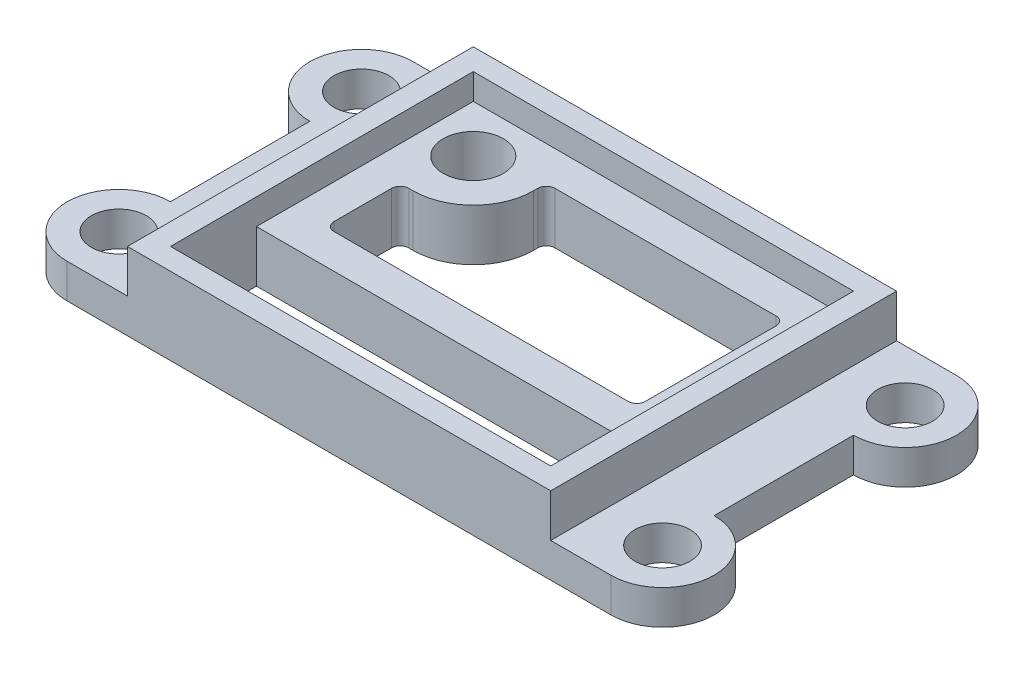
ISO-10303-21;
HEADER;
FILE_DESCRIPTION(('STEP AP214'),'2;1');
FILE_NAME('part.step','',(''),(''),'','','');
FILE_SCHEMA(('AUTOMOTIVE_DESIGN { 1 0 10303 214 1 1 1 1 }'));
ENDSEC;
DATA;
#1=APPLICATION_CONTEXT('core data for automotive mechanical design processes');
#2=APPLICATION_PROTOCOL_DEFINITION('international standard','automotive_design',2000,#1);
#3=PRODUCT_CONTEXT('',#1,'mechanical');
#4=PRODUCT('Part','Part','',(#3));
#5=PRODUCT_RELATED_PRODUCT_CATEGORY('part','',(#4));
#6=PRODUCT_DEFINITION_FORMATION('','',#4);
#7=PRODUCT_DEFINITION_CONTEXT('part definition',#1,'design');
#8=PRODUCT_DEFINITION('design','',#6,#7);
#9=PRODUCT_DEFINITION_SHAPE('','',#8);
#10=(LENGTH_UNIT() NAMED_UNIT(*) SI_UNIT(.MILLI.,.METRE.));
#11=(NAMED_UNIT(*) PLANE_ANGLE_UNIT() SI_UNIT($,.RADIAN.));
#12=(NAMED_UNIT(*) SI_UNIT($,.STERADIAN.) SOLID_ANGLE_UNIT());
#13=UNCERTAINTY_MEASURE_WITH_UNIT(LENGTH_MEASURE(1.E-05),#10,'distance_accuracy_value','');
#14=(GEOMETRIC_REPRESENTATION_CONTEXT(3) GLOBAL_UNCERTAINTY_ASSIGNED_CONTEXT((#13)) GLOBAL_UNIT_ASSIGNED_CONTEXT((#10,
#11,#12)) REPRESENTATION_CONTEXT('',''));
#15=CARTESIAN_POINT('',(0.,0.,0.));
#16=DIRECTION('',(0.,0.,1.));
#17=DIRECTION('',(1.,0.,0.));
#18=AXIS2_PLACEMENT_3D('',#15,#16,#17);
#19=CARTESIAN_POINT('',(12.3,1.5,-10.05));
#20=DIRECTION('',(-1.,0.,0.));
#21=DIRECTION('',(0.,0.,1.));
#22=AXIS2_PLACEMENT_3D('',#19,#20,#21);
#23=PLANE('',#22);
#24=DIRECTION('',(0.,0.,1.));
#25=VECTOR('',#24,1.);
#26=CARTESIAN_POINT('',(12.3,2.,10.05));
#27=LINE('',#26,#25);
#28=CARTESIAN_POINT('',(12.3,2.,-10.05));
#29=VERTEX_POINT('',#28);
#30=CARTESIAN_POINT('',(12.3,2.,10.05));
#31=VERTEX_POINT('',#30);
#32=EDGE_CURVE('E338',#29,#31,#27,.T.);
#33=ORIENTED_EDGE('',*,*,#32,.F.);
#34=DIRECTION('',(0.,-1.,0.));
#35=VECTOR('',#34,1.);
#36=CARTESIAN_POINT('',(12.3,1.5,-10.05));
#37=LINE('',#36,#35);
#38=CARTESIAN_POINT('',(12.3,4.5,-10.05));
#39=VERTEX_POINT('',#38);
#40=EDGE_CURVE('E450',#39,#29,#37,.T.);
#41=ORIENTED_EDGE('',*,*,#40,.F.);
#42=DIRECTION('',(0.,0.,-1.));
#43=VECTOR('',#42,1.);
#44=CARTESIAN_POINT('',(12.3,4.5,-10.05));
#45=LINE('',#44,#43);
#46=CARTESIAN_POINT('',(12.3,4.5,10.05));
#47=VERTEX_POINT('',#46);
#48=EDGE_CURVE('E433',#47,#39,#45,.T.);
#49=ORIENTED_EDGE('',*,*,#48,.F.);
#50=DIRECTION('',(0.,-1.,0.));
#51=VECTOR('',#50,1.);
#52=CARTESIAN_POINT('',(12.3,1.5,10.05));
#53=LINE('',#52,#51);
#54=EDGE_CURVE('E454',#47,#31,#53,.T.);
#55=ORIENTED_EDGE('',*,*,#54,.T.);
#56=EDGE_LOOP('',(#33,#41,#49,#55));
#57=FACE_BOUND('',#56,.T.);
#58=ADVANCED_FACE('F45',(#57),#23,.F.);
#59=CARTESIAN_POINT('',(-12.3,1.5,-10.05));
#60=DIRECTION('',(1.,0.,0.));
#61=DIRECTION('',(0.,0.,-1.));
#62=AXIS2_PLACEMENT_3D('',#59,#60,#61);
#63=PLANE('',#62);
#64=DIRECTION('',(0.,0.,-1.));
#65=VECTOR('',#64,1.);
#66=CARTESIAN_POINT('',(-12.3,2.,-10.05));
#67=LINE('',#66,#65);
#68=CARTESIAN_POINT('',(-12.3,2.,10.05));
#69=VERTEX_POINT('',#68);
#70=CARTESIAN_POINT('',(-12.3,2.,-10.05));
#71=VERTEX_POINT('',#70);
#72=EDGE_CURVE('E309',#69,#71,#67,.T.);
#73=ORIENTED_EDGE('',*,*,#72,.F.);
#74=DIRECTION('',(0.,-1.,0.));
#75=VECTOR('',#74,1.);
#76=CARTESIAN_POINT('',(-12.3,1.5,10.05));
#77=LINE('',#76,#75);
#78=CARTESIAN_POINT('',(-12.3,4.5,10.05));
#79=VERTEX_POINT('',#78);
#80=EDGE_CURVE('E54',#79,#69,#77,.T.);
#81=ORIENTED_EDGE('',*,*,#80,.F.);
#82=DIRECTION('',(0.,0.,1.));
#83=VECTOR('',#82,1.);
#84=CARTESIAN_POINT('',(-12.3,4.5,-10.05));
#85=LINE('',#84,#83);
#86=CARTESIAN_POINT('',(-12.3,4.5,-10.05));
#87=VERTEX_POINT('',#86);
#88=EDGE_CURVE('E425',#87,#79,#85,.T.);
#89=ORIENTED_EDGE('',*,*,#88,.F.);
#90=DIRECTION('',(0.,-1.,0.));
#91=VECTOR('',#90,1.);
#92=CARTESIAN_POINT('',(-12.3,1.5,-10.05));
#93=LINE('',#92,#91);
#94=EDGE_CURVE('E11',#87,#71,#93,.T.);
#95=ORIENTED_EDGE('',*,*,#94,.T.);
#96=EDGE_LOOP('',(#73,#81,#89,#95));
#97=FACE_BOUND('',#96,.T.);
#98=ADVANCED_FACE('F643',(#97),#63,.F.);
#99=CARTESIAN_POINT('',(0.,0.,0.));
#100=DIRECTION('',(0.,-1.,0.));
#101=DIRECTION('',(0.,0.,-1.));
#102=AXIS2_PLACEMENT_3D('',#99,#100,#101);
#103=PLANE('',#102);
#104=CARTESIAN_POINT('',(15.8,0.,-7.05));
#105=DIRECTION('',(0.,1.,0.));
#106=DIRECTION('',(0.,0.,1.));
#107=AXIS2_PLACEMENT_3D('',#104,#105,#106);
#108=CIRCLE('',#107,3.);
#109=CARTESIAN_POINT('',(15.8,0.,-4.05));
#110=VERTEX_POINT('',#109);
#111=CARTESIAN_POINT('',(15.8,0.,-10.05));
#112=VERTEX_POINT('',#111);
#113=EDGE_CURVE('E354',#110,#112,#108,.T.);
#114=ORIENTED_EDGE('',*,*,#113,.F.);
#115=DIRECTION('',(0.,0.,-1.));
#116=VECTOR('',#115,1.);
#117=CARTESIAN_POINT('',(15.8,0.,-4.05));
#118=LINE('',#117,#116);
#119=CARTESIAN_POINT('',(15.8,0.,4.04999999999999));
#120=VERTEX_POINT('',#119);
#121=EDGE_CURVE('E615',#120,#110,#118,.T.);
#122=ORIENTED_EDGE('',*,*,#121,.F.);
#123=CARTESIAN_POINT('',(15.8,0.,7.05));
#124=DIRECTION('',(0.,1.,0.));
#125=DIRECTION('',(0.,0.,-1.));
#126=AXIS2_PLACEMENT_3D('',#123,#124,#125);
#127=CIRCLE('',#126,3.);
#128=CARTESIAN_POINT('',(15.8,0.,10.05));
#129=VERTEX_POINT('',#128);
#130=EDGE_CURVE('E330',#129,#120,#127,.T.);
#131=ORIENTED_EDGE('',*,*,#130,.F.);
#132=DIRECTION('',(1.,0.,0.));
#133=VECTOR('',#132,1.);
#134=CARTESIAN_POINT('',(-12.3,0.,10.05));
#135=LINE('',#134,#133);
#136=CARTESIAN_POINT('',(-15.8,0.,10.05));
#137=VERTEX_POINT('',#136);
#138=EDGE_CURVE('E274',#137,#129,#135,.T.);
#139=ORIENTED_EDGE('',*,*,#138,.F.);
#140=CARTESIAN_POINT('',(-15.8,0.,7.05));
#141=DIRECTION('',(0.,1.,0.));
#142=DIRECTION('',(0.,0.,1.));
#143=AXIS2_PLACEMENT_3D('',#140,#141,#142);
#144=CIRCLE('',#143,3.);
#145=CARTESIAN_POINT('',(-15.8,0.,4.05));
#146=VERTEX_POINT('',#145);
#147=EDGE_CURVE('E263',#146,#137,#144,.T.);
#148=ORIENTED_EDGE('',*,*,#147,.F.);
#149=DIRECTION('',(0.,0.,1.));
#150=VECTOR('',#149,1.);
#151=CARTESIAN_POINT('',(-15.8,0.,-4.05));
#152=LINE('',#151,#150);
#153=CARTESIAN_POINT('',(-15.8,0.,-4.05));
#154=VERTEX_POINT('',#153);
#155=EDGE_CURVE('E243',#154,#146,#152,.T.);
#156=ORIENTED_EDGE('',*,*,#155,.F.);
#157=CARTESIAN_POINT('',(-15.8,0.,-7.05));
#158=DIRECTION('',(0.,1.,0.));
#159=DIRECTION('',(0.,0.,-1.));
#160=AXIS2_PLACEMENT_3D('',#157,#158,#159);
#161=CIRCLE('',#160,3.);
#162=CARTESIAN_POINT('',(-15.8,0.,-10.05));
#163=VERTEX_POINT('',#162);
#164=EDGE_CURVE('E302',#163,#154,#161,.T.);
#165=ORIENTED_EDGE('',*,*,#164,.F.);
#166=DIRECTION('',(-1.,0.,0.));
#167=VECTOR('',#166,1.);
#168=CARTESIAN_POINT('',(-12.3,0.,-10.05));
#169=LINE('',#168,#167);
#170=EDGE_CURVE('E445',#112,#163,#169,.T.);
#171=ORIENTED_EDGE('',*,*,#170,.F.);
#172=EDGE_LOOP('',(#114,#122,#131,#139,#148,#156,#165,#171));
#173=FACE_BOUND('',#172,.T.);
#174=DIRECTION('',(0.,0.,1.));
#175=VECTOR('',#174,1.);
#176=CARTESIAN_POINT('',(-11.05,0.,3.8));
#177=LINE('',#176,#175);
#178=CARTESIAN_POINT('',(-11.05,0.,3.8));
#179=VERTEX_POINT('',#178);
#180=CARTESIAN_POINT('',(-11.05,0.,8.8));
#181=VERTEX_POINT('',#180);
#182=EDGE_CURVE('E255',#179,#181,#177,.T.);
#183=ORIENTED_EDGE('',*,*,#182,.T.);
#184=DIRECTION('',(1.,0.,0.));
#185=VECTOR('',#184,1.);
#186=CARTESIAN_POINT('',(-11.05,0.,8.8));
#187=LINE('',#186,#185);
#188=CARTESIAN_POINT('',(11.05,0.,8.8));
#189=VERTEX_POINT('',#188);
#190=EDGE_CURVE('E608',#181,#189,#187,.T.);
#191=ORIENTED_EDGE('',*,*,#190,.T.);
#192=DIRECTION('',(0.,0.,-1.));
#193=VECTOR('',#192,1.);
#194=CARTESIAN_POINT('',(11.05,0.,3.8));
#195=LINE('',#194,#193);
#196=CARTESIAN_POINT('',(11.05,0.,3.8));
#197=VERTEX_POINT('',#196);
#198=EDGE_CURVE('E604',#189,#197,#195,.T.);
#199=ORIENTED_EDGE('',*,*,#198,.T.);
#200=DIRECTION('',(-1.,0.,0.));
#201=VECTOR('',#200,1.);
#202=CARTESIAN_POINT('',(-11.05,0.,3.8));
#203=LINE('',#202,#201);
#204=EDGE_CURVE('E556',#197,#179,#203,.T.);
#205=ORIENTED_EDGE('',*,*,#204,.T.);
#206=EDGE_LOOP('',(#183,#191,#199,#205));
#207=FACE_BOUND('',#206,.T.);
#208=CARTESIAN_POINT('',(-8.3,0.,-6.05));
#209=DIRECTION('',(0.,-1.,0.));
#210=DIRECTION('',(0.,0.,1.));
#211=AXIS2_PLACEMENT_3D('',#208,#209,#210);
#212=CIRCLE('',#211,3.5);
#213=CARTESIAN_POINT('',(-4.8,0.,-6.05));
#214=VERTEX_POINT('',#213);
#215=CARTESIAN_POINT('',(-8.3,0.,-2.55));
#216=VERTEX_POINT('',#215);
#217=EDGE_CURVE('E512',#214,#216,#212,.T.);
#218=ORIENTED_EDGE('',*,*,#217,.T.);
#219=DIRECTION('',(-1.,0.,0.));
#220=VECTOR('',#219,1.);
#221=CARTESIAN_POINT('',(-8.55,0.,-2.55));
#222=LINE('',#221,#220);
#223=CARTESIAN_POINT('',(-8.55,0.,-2.55));
#224=VERTEX_POINT('',#223);
#225=EDGE_CURVE('E594',#216,#224,#222,.T.);
#226=ORIENTED_EDGE('',*,*,#225,.T.);
#227=CARTESIAN_POINT('',(-8.55,0.,-2.05));
#228=DIRECTION('',(0.,1.,0.));
#229=DIRECTION('',(0.,0.,-1.));
#230=AXIS2_PLACEMENT_3D('',#227,#228,#229);
#231=CIRCLE('',#230,0.5);
#232=CARTESIAN_POINT('',(-9.05,0.,-2.05));
#233=VERTEX_POINT('',#232);
#234=EDGE_CURVE('E69',#224,#233,#231,.T.);
#235=ORIENTED_EDGE('',*,*,#234,.T.);
#236=DIRECTION('',(0.,0.,1.));
#237=VECTOR('',#236,1.);
#238=CARTESIAN_POINT('',(-9.05,0.,1.3));
#239=LINE('',#238,#237);
#240=CARTESIAN_POINT('',(-9.05,0.,1.3));
#241=VERTEX_POINT('',#240);
#242=EDGE_CURVE('E588',#233,#241,#239,.T.);
#243=ORIENTED_EDGE('',*,*,#242,.T.);
#244=CARTESIAN_POINT('',(-8.55,0.,1.3));
#245=DIRECTION('',(0.,1.,0.));
#246=DIRECTION('',(0.,0.,1.));
#247=AXIS2_PLACEMENT_3D('',#244,#245,#246);
#248=CIRCLE('',#247,0.5);
#249=CARTESIAN_POINT('',(-8.55,0.,1.8));
#250=VERTEX_POINT('',#249);
#251=EDGE_CURVE('E584',#241,#250,#248,.T.);
#252=ORIENTED_EDGE('',*,*,#251,.T.);
#253=DIRECTION('',(1.,0.,0.));
#254=VECTOR('',#253,1.);
#255=CARTESIAN_POINT('',(8.55,0.,1.8));
#256=LINE('',#255,#254);
#257=CARTESIAN_POINT('',(8.55,0.,1.8));
#258=VERTEX_POINT('',#257);
#259=EDGE_CURVE('E580',#250,#258,#256,.T.);
#260=ORIENTED_EDGE('',*,*,#259,.T.);
#261=CARTESIAN_POINT('',(8.55,0.,1.3));
#262=DIRECTION('',(0.,1.,0.));
#263=DIRECTION('',(0.,0.,-1.));
#264=AXIS2_PLACEMENT_3D('',#261,#262,#263);
#265=CIRCLE('',#264,0.5);
#266=CARTESIAN_POINT('',(9.05,0.,1.3));
#267=VERTEX_POINT('',#266);
#268=EDGE_CURVE('E576',#258,#267,#265,.T.);
#269=ORIENTED_EDGE('',*,*,#268,.T.);
#270=DIRECTION('',(0.,0.,-1.));
#271=VECTOR('',#270,1.);
#272=CARTESIAN_POINT('',(9.05,0.,-6.29999999999999));
#273=LINE('',#272,#271);
#274=CARTESIAN_POINT('',(9.05,0.,-6.29999999999999));
#275=VERTEX_POINT('',#274);
#276=EDGE_CURVE('E572',#267,#275,#273,.T.);
#277=ORIENTED_EDGE('',*,*,#276,.T.);
#278=CARTESIAN_POINT('',(8.55,0.,-6.3));
#279=DIRECTION('',(0.,1.,0.));
#280=DIRECTION('',(0.,0.,-1.));
#281=AXIS2_PLACEMENT_3D('',#278,#279,#280);
#282=CIRCLE('',#281,0.5);
#283=CARTESIAN_POINT('',(8.55,0.,-6.8));
#284=VERTEX_POINT('',#283);
#285=EDGE_CURVE('E568',#275,#284,#282,.T.);
#286=ORIENTED_EDGE('',*,*,#285,.T.);
#287=DIRECTION('',(-1.,0.,0.));
#288=VECTOR('',#287,1.);
#289=CARTESIAN_POINT('',(-4.3,0.,-6.8));
#290=LINE('',#289,#288);
#291=CARTESIAN_POINT('',(-4.3,0.,-6.8));
#292=VERTEX_POINT('',#291);
#293=EDGE_CURVE('E564',#284,#292,#290,.T.);
#294=ORIENTED_EDGE('',*,*,#293,.T.);
#295=CARTESIAN_POINT('',(-4.3,0.,-6.3));
#296=DIRECTION('',(0.,1.,0.));
#297=DIRECTION('',(0.,0.,-1.));
#298=AXIS2_PLACEMENT_3D('',#295,#296,#297);
#299=CIRCLE('',#298,0.5);
#300=CARTESIAN_POINT('',(-4.8,0.,-6.3));
#301=VERTEX_POINT('',#300);
#302=EDGE_CURVE('E560',#292,#301,#299,.T.);
#303=ORIENTED_EDGE('',*,*,#302,.T.);
#304=DIRECTION('',(0.,0.,1.));
#305=VECTOR('',#304,1.);
#306=CARTESIAN_POINT('',(-4.8,0.,-6.05));
#307=LINE('',#306,#305);
#308=EDGE_CURVE('E479',#301,#214,#307,.T.);
#309=ORIENTED_EDGE('',*,*,#308,.T.);
#310=EDGE_LOOP('',(#218,#226,#235,#243,#252,#260,#269,#277,#286,#294,#303,#309));
#311=FACE_BOUND('',#310,.T.);
#312=CARTESIAN_POINT('',(-8.3,0.,-6.05));
#313=DIRECTION('',(0.,1.,0.));
#314=DIRECTION('',(0.,0.,1.));
#315=AXIS2_PLACEMENT_3D('',#312,#313,#314);
#316=CIRCLE('',#315,1.75);
#317=CARTESIAN_POINT('',(-8.3,0.,-4.3));
#318=VERTEX_POINT('',#317);
#319=EDGE_CURVE('E441',#318,#318,#316,.T.);
#320=ORIENTED_EDGE('',*,*,#319,.T.);
#321=EDGE_LOOP('',(#320));
#322=FACE_BOUND('',#321,.T.);
#323=CARTESIAN_POINT('',(15.8,0.,-7.05));
#324=DIRECTION('',(0.,1.,0.));
#325=DIRECTION('',(0.,0.,1.));
#326=AXIS2_PLACEMENT_3D('',#323,#324,#325);
#327=CIRCLE('',#326,1.6);
#328=CARTESIAN_POINT('',(15.8,0.,-5.45));
#329=VERTEX_POINT('',#328);
#330=EDGE_CURVE('E319',#329,#329,#327,.T.);
#331=ORIENTED_EDGE('',*,*,#330,.T.);
#332=EDGE_LOOP('',(#331));
#333=FACE_BOUND('',#332,.T.);
#334=CARTESIAN_POINT('',(15.8,0.,7.05));
#335=DIRECTION('',(0.,1.,0.));
#336=DIRECTION('',(0.,0.,-1.));
#337=AXIS2_PLACEMENT_3D('',#334,#335,#336);
#338=CIRCLE('',#337,1.6);
#339=CARTESIAN_POINT('',(15.8,0.,5.45));
#340=VERTEX_POINT('',#339);
#341=EDGE_CURVE('E297',#340,#340,#338,.T.);
#342=ORIENTED_EDGE('',*,*,#341,.T.);
#343=EDGE_LOOP('',(#342));
#344=FACE_BOUND('',#343,.T.);
#345=CARTESIAN_POINT('',(-15.8,0.,7.05));
#346=DIRECTION('',(0.,1.,0.));
#347=DIRECTION('',(0.,0.,1.));
#348=AXIS2_PLACEMENT_3D('',#345,#346,#347);
#349=CIRCLE('',#348,1.6);
#350=CARTESIAN_POINT('',(-15.8,0.,8.65));
#351=VERTEX_POINT('',#350);
#352=EDGE_CURVE('E282',#351,#351,#349,.T.);
#353=ORIENTED_EDGE('',*,*,#352,.T.);
#354=EDGE_LOOP('',(#353));
#355=FACE_BOUND('',#354,.T.);
#356=CARTESIAN_POINT('',(-15.8,0.,-7.05));
#357=DIRECTION('',(0.,1.,0.));
#358=DIRECTION('',(0.,0.,-1.));
#359=AXIS2_PLACEMENT_3D('',#356,#357,#358);
#360=CIRCLE('',#359,1.6);
#361=CARTESIAN_POINT('',(-15.8,0.,-8.65));
#362=VERTEX_POINT('',#361);
#363=EDGE_CURVE('E315',#362,#362,#360,.T.);
#364=ORIENTED_EDGE('',*,*,#363,.T.);
#365=EDGE_LOOP('',(#364));
#366=FACE_BOUND('',#365,.T.);
#367=ADVANCED_FACE('F271',(#173,#207,#311,#322,#333,#344,#355,#366),#103,.T.);
#368=CARTESIAN_POINT('',(-12.3,1.5,-10.05));
#369=DIRECTION('',(0.,0.,1.));
#370=DIRECTION('',(1.,0.,0.));
#371=AXIS2_PLACEMENT_3D('',#368,#369,#370);
#372=PLANE('',#371);
#373=ORIENTED_EDGE('',*,*,#170,.T.);
#374=DIRECTION('',(0.,-1.,0.));
#375=VECTOR('',#374,1.);
#376=CARTESIAN_POINT('',(-15.8,2.,-10.05));
#377=LINE('',#376,#375);
#378=CARTESIAN_POINT('',(-15.8,2.,-10.05));
#379=VERTEX_POINT('',#378);
#380=EDGE_CURVE('E296',#379,#163,#377,.T.);
#381=ORIENTED_EDGE('',*,*,#380,.F.);
#382=DIRECTION('',(-1.,0.,0.));
#383=VECTOR('',#382,1.);
#384=CARTESIAN_POINT('',(-15.8,2.,-10.05));
#385=LINE('',#384,#383);
#386=EDGE_CURVE('E301',#71,#379,#385,.T.);
#387=ORIENTED_EDGE('',*,*,#386,.F.);
#388=ORIENTED_EDGE('',*,*,#94,.F.);
#389=DIRECTION('',(-1.,0.,0.));
#390=VECTOR('',#389,1.);
#391=CARTESIAN_POINT('',(-12.3,4.5,-10.05));
#392=LINE('',#391,#390);
#393=EDGE_CURVE('E437',#39,#87,#392,.T.);
#394=ORIENTED_EDGE('',*,*,#393,.F.);
#395=ORIENTED_EDGE('',*,*,#40,.T.);
#396=DIRECTION('',(-1.,0.,0.));
#397=VECTOR('',#396,1.);
#398=CARTESIAN_POINT('',(15.8,2.,-10.05));
#399=LINE('',#398,#397);
#400=CARTESIAN_POINT('',(15.8,2.,-10.05));
#401=VERTEX_POINT('',#400);
#402=EDGE_CURVE('E362',#401,#29,#399,.T.);
#403=ORIENTED_EDGE('',*,*,#402,.F.);
#404=DIRECTION('',(0.,-1.,0.));
#405=VECTOR('',#404,1.);
#406=CARTESIAN_POINT('',(15.8,2.,-10.05));
#407=LINE('',#406,#405);
#408=EDGE_CURVE('E373',#401,#112,#407,.T.);
#409=ORIENTED_EDGE('',*,*,#408,.T.);
#410=EDGE_LOOP('',(#373,#381,#387,#388,#394,#395,#403,#409));
#411=FACE_BOUND('',#410,.T.);
#412=ADVANCED_FACE('F47',(#411),#372,.F.);
#413=CARTESIAN_POINT('',(-12.3,1.5,10.05));
#414=DIRECTION('',(0.,0.,-1.));
#415=DIRECTION('',(-1.,0.,0.));
#416=AXIS2_PLACEMENT_3D('',#413,#414,#415);
#417=PLANE('',#416);
#418=ORIENTED_EDGE('',*,*,#138,.T.);
#419=DIRECTION('',(0.,-1.,0.));
#420=VECTOR('',#419,1.);
#421=CARTESIAN_POINT('',(15.8,2.,10.05));
#422=LINE('',#421,#420);
#423=CARTESIAN_POINT('',(15.8,2.,10.05));
#424=VERTEX_POINT('',#423);
#425=EDGE_CURVE('E325',#424,#129,#422,.T.);
#426=ORIENTED_EDGE('',*,*,#425,.F.);
#427=DIRECTION('',(1.,0.,0.));
#428=VECTOR('',#427,1.);
#429=CARTESIAN_POINT('',(15.8,2.,10.05));
#430=LINE('',#429,#428);
#431=EDGE_CURVE('E329',#31,#424,#430,.T.);
#432=ORIENTED_EDGE('',*,*,#431,.F.);
#433=ORIENTED_EDGE('',*,*,#54,.F.);
#434=DIRECTION('',(1.,0.,0.));
#435=VECTOR('',#434,1.);
#436=CARTESIAN_POINT('',(-12.3,4.5,10.05));
#437=LINE('',#436,#435);
#438=EDGE_CURVE('E429',#79,#47,#437,.T.);
#439=ORIENTED_EDGE('',*,*,#438,.F.);
#440=ORIENTED_EDGE('',*,*,#80,.T.);
#441=DIRECTION('',(1.,0.,0.));
#442=VECTOR('',#441,1.);
#443=CARTESIAN_POINT('',(-15.8,2.,10.05));
#444=LINE('',#443,#442);
#445=CARTESIAN_POINT('',(-15.8,2.,10.05));
#446=VERTEX_POINT('',#445);
#447=EDGE_CURVE('E267',#446,#69,#444,.T.);
#448=ORIENTED_EDGE('',*,*,#447,.F.);
#449=DIRECTION('',(0.,-1.,0.));
#450=VECTOR('',#449,1.);
#451=CARTESIAN_POINT('',(-15.8,2.,10.05));
#452=LINE('',#451,#450);
#453=EDGE_CURVE('E268',#446,#137,#452,.T.);
#454=ORIENTED_EDGE('',*,*,#453,.T.);
#455=EDGE_LOOP('',(#418,#426,#432,#433,#439,#440,#448,#454));
#456=FACE_BOUND('',#455,.T.);
#457=ADVANCED_FACE('F461',(#456),#417,.F.);
#458=CARTESIAN_POINT('',(-8.3,1.5,-6.05));
#459=DIRECTION('',(0.,-1.,0.));
#460=DIRECTION('',(0.,0.,-1.));
#461=AXIS2_PLACEMENT_3D('',#458,#459,#460);
#462=CYLINDRICAL_SURFACE('',#461,1.75);
#463=ORIENTED_EDGE('',*,*,#319,.F.);
#464=EDGE_LOOP('',(#463));
#465=FACE_BOUND('',#464,.T.);
#466=CARTESIAN_POINT('',(-8.3,3.,-6.05));
#467=DIRECTION('',(0.,1.,0.));
#468=DIRECTION('',(0.,0.,1.));
#469=AXIS2_PLACEMENT_3D('',#466,#467,#468);
#470=CIRCLE('',#469,1.75);
#471=CARTESIAN_POINT('',(-8.3,3.,-4.3));
#472=VERTEX_POINT('',#471);
#473=EDGE_CURVE('E377',#472,#472,#470,.T.);
#474=ORIENTED_EDGE('',*,*,#473,.T.);
#475=EDGE_LOOP('',(#474));
#476=FACE_BOUND('',#475,.T.);
#477=ADVANCED_FACE('F653',(#465,#476),#462,.F.);
#478=CARTESIAN_POINT('',(0.,4.5,0.));
#479=DIRECTION('',(0.,1.,0.));
#480=DIRECTION('',(0.,0.,1.));
#481=AXIS2_PLACEMENT_3D('',#478,#479,#480);
#482=PLANE('',#481);
#483=ORIENTED_EDGE('',*,*,#88,.T.);
#484=ORIENTED_EDGE('',*,*,#438,.T.);
#485=ORIENTED_EDGE('',*,*,#48,.T.);
#486=ORIENTED_EDGE('',*,*,#393,.T.);
#487=EDGE_LOOP('',(#483,#484,#485,#486));
#488=FACE_BOUND('',#487,.T.);
#489=DIRECTION('',(0.,0.,1.));
#490=VECTOR('',#489,1.);
#491=CARTESIAN_POINT('',(-11.05,4.5,-8.8));
#492=LINE('',#491,#490);
#493=CARTESIAN_POINT('',(-11.05,4.5,-8.8));
#494=VERTEX_POINT('',#493);
#495=CARTESIAN_POINT('',(-11.05,4.5,8.8));
#496=VERTEX_POINT('',#495);
#497=EDGE_CURVE('E403',#494,#496,#492,.T.);
#498=ORIENTED_EDGE('',*,*,#497,.F.);
#499=DIRECTION('',(-1.,0.,0.));
#500=VECTOR('',#499,1.);
#501=CARTESIAN_POINT('',(-11.05,4.5,-8.8));
#502=LINE('',#501,#500);
#503=CARTESIAN_POINT('',(11.05,4.5,-8.8));
#504=VERTEX_POINT('',#503);
#505=EDGE_CURVE('E400',#504,#494,#502,.T.);
#506=ORIENTED_EDGE('',*,*,#505,.F.);
#507=DIRECTION('',(0.,0.,-1.));
#508=VECTOR('',#507,1.);
#509=CARTESIAN_POINT('',(11.05,4.5,-8.8));
#510=LINE('',#509,#508);
#511=CARTESIAN_POINT('',(11.05,4.5,8.8));
#512=VERTEX_POINT('',#511);
#513=EDGE_CURVE('E409',#512,#504,#510,.T.);
#514=ORIENTED_EDGE('',*,*,#513,.F.);
#515=DIRECTION('',(1.,0.,0.));
#516=VECTOR('',#515,1.);
#517=CARTESIAN_POINT('',(-11.05,4.5,8.8));
#518=LINE('',#517,#516);
#519=EDGE_CURVE('E406',#496,#512,#518,.T.);
#520=ORIENTED_EDGE('',*,*,#519,.F.);
#521=EDGE_LOOP('',(#498,#506,#514,#520));
#522=FACE_BOUND('',#521,.T.);
#523=ADVANCED_FACE('F641',(#488,#522),#482,.T.);
#524=CARTESIAN_POINT('',(-11.05,4.5,-8.8));
#525=DIRECTION('',(0.,0.,1.));
#526=DIRECTION('',(1.,0.,0.));
#527=AXIS2_PLACEMENT_3D('',#524,#525,#526);
#528=PLANE('',#527);
#529=DIRECTION('',(-1.,0.,0.));
#530=VECTOR('',#529,1.);
#531=CARTESIAN_POINT('',(-11.05,3.,-8.8));
#532=LINE('',#531,#530);
#533=CARTESIAN_POINT('',(11.05,3.,-8.8));
#534=VERTEX_POINT('',#533);
#535=CARTESIAN_POINT('',(-11.05,3.,-8.8));
#536=VERTEX_POINT('',#535);
#537=EDGE_CURVE('E391',#534,#536,#532,.T.);
#538=ORIENTED_EDGE('',*,*,#537,.F.);
#539=DIRECTION('',(0.,-1.,0.));
#540=VECTOR('',#539,1.);
#541=CARTESIAN_POINT('',(11.05,4.5,-8.8));
#542=LINE('',#541,#540);
#543=EDGE_CURVE('E412',#504,#534,#542,.T.);
#544=ORIENTED_EDGE('',*,*,#543,.F.);
#545=ORIENTED_EDGE('',*,*,#505,.T.);
#546=DIRECTION('',(0.,-1.,0.));
#547=VECTOR('',#546,1.);
#548=CARTESIAN_POINT('',(-11.05,4.5,-8.8));
#549=LINE('',#548,#547);
#550=EDGE_CURVE('E421',#494,#536,#549,.T.);
#551=ORIENTED_EDGE('',*,*,#550,.T.);
#552=EDGE_LOOP('',(#538,#544,#545,#551));
#553=FACE_BOUND('',#552,.T.);
#554=ADVANCED_FACE('F660',(#553),#528,.T.);
#555=CARTESIAN_POINT('',(-11.05,4.5,-8.8));
#556=DIRECTION('',(1.,0.,0.));
#557=DIRECTION('',(0.,0.,-1.));
#558=AXIS2_PLACEMENT_3D('',#555,#556,#557);
#559=PLANE('',#558);
#560=DIRECTION('',(0.,0.,1.));
#561=VECTOR('',#560,1.);
#562=CARTESIAN_POINT('',(-11.05,3.,-8.8));
#563=LINE('',#562,#561);
#564=CARTESIAN_POINT('',(-11.05,3.,3.8));
#565=VERTEX_POINT('',#564);
#566=EDGE_CURVE('E381',#536,#565,#563,.T.);
#567=ORIENTED_EDGE('',*,*,#566,.F.);
#568=ORIENTED_EDGE('',*,*,#550,.F.);
#569=ORIENTED_EDGE('',*,*,#497,.T.);
#570=DIRECTION('',(0.,-1.,0.));
#571=VECTOR('',#570,1.);
#572=CARTESIAN_POINT('',(-11.05,4.5,8.8));
#573=LINE('',#572,#571);
#574=EDGE_CURVE('E418',#496,#181,#573,.T.);
#575=ORIENTED_EDGE('',*,*,#574,.T.);
#576=ORIENTED_EDGE('',*,*,#182,.F.);
#577=DIRECTION('',(0.,-1.,0.));
#578=VECTOR('',#577,1.);
#579=CARTESIAN_POINT('',(-11.05,3.,3.8));
#580=LINE('',#579,#578);
#581=EDGE_CURVE('E397',#565,#179,#580,.T.);
#582=ORIENTED_EDGE('',*,*,#581,.F.);
#583=EDGE_LOOP('',(#567,#568,#569,#575,#576,#582));
#584=FACE_BOUND('',#583,.T.);
#585=ADVANCED_FACE('F663',(#584),#559,.T.);
#586=CARTESIAN_POINT('',(-11.05,4.5,8.8));
#587=DIRECTION('',(0.,0.,-1.));
#588=DIRECTION('',(-1.,0.,0.));
#589=AXIS2_PLACEMENT_3D('',#586,#587,#588);
#590=PLANE('',#589);
#591=DIRECTION('',(0.,-1.,0.));
#592=VECTOR('',#591,1.);
#593=CARTESIAN_POINT('',(11.05,4.5,8.8));
#594=LINE('',#593,#592);
#595=EDGE_CURVE('E61',#512,#189,#594,.T.);
#596=ORIENTED_EDGE('',*,*,#595,.T.);
#597=ORIENTED_EDGE('',*,*,#190,.F.);
#598=ORIENTED_EDGE('',*,*,#574,.F.);
#599=ORIENTED_EDGE('',*,*,#519,.T.);
#600=EDGE_LOOP('',(#596,#597,#598,#599));
#601=FACE_BOUND('',#600,.T.);
#602=ADVANCED_FACE('F667',(#601),#590,.T.);
#603=CARTESIAN_POINT('',(11.05,4.5,-8.8));
#604=DIRECTION('',(-1.,0.,0.));
#605=DIRECTION('',(0.,0.,1.));
#606=AXIS2_PLACEMENT_3D('',#603,#604,#605);
#607=PLANE('',#606);
#608=DIRECTION('',(0.,0.,-1.));
#609=VECTOR('',#608,1.);
#610=CARTESIAN_POINT('',(11.05,3.,-8.8));
#611=LINE('',#610,#609);
#612=CARTESIAN_POINT('',(11.05,3.,3.8));
#613=VERTEX_POINT('',#612);
#614=EDGE_CURVE('E388',#613,#534,#611,.T.);
#615=ORIENTED_EDGE('',*,*,#614,.F.);
#616=DIRECTION('',(0.,-1.,0.));
#617=VECTOR('',#616,1.);
#618=CARTESIAN_POINT('',(11.05,3.,3.8));
#619=LINE('',#618,#617);
#620=EDGE_CURVE('E394',#613,#197,#619,.T.);
#621=ORIENTED_EDGE('',*,*,#620,.T.);
#622=ORIENTED_EDGE('',*,*,#198,.F.);
#623=ORIENTED_EDGE('',*,*,#595,.F.);
#624=ORIENTED_EDGE('',*,*,#513,.T.);
#625=ORIENTED_EDGE('',*,*,#543,.T.);
#626=EDGE_LOOP('',(#615,#621,#622,#623,#624,#625));
#627=FACE_BOUND('',#626,.T.);
#628=ADVANCED_FACE('F671',(#627),#607,.T.);
#629=CARTESIAN_POINT('',(0.,3.,0.));
#630=DIRECTION('',(0.,1.,0.));
#631=DIRECTION('',(0.,0.,1.));
#632=AXIS2_PLACEMENT_3D('',#629,#630,#631);
#633=PLANE('',#632);
#634=CARTESIAN_POINT('',(-8.3,3.,-6.05));
#635=DIRECTION('',(0.,-1.,0.));
#636=DIRECTION('',(0.,0.,1.));
#637=AXIS2_PLACEMENT_3D('',#634,#635,#636);
#638=CIRCLE('',#637,3.5);
#639=CARTESIAN_POINT('',(-4.8,3.,-6.05));
#640=VERTEX_POINT('',#639);
#641=CARTESIAN_POINT('',(-8.3,3.,-2.55));
#642=VERTEX_POINT('',#641);
#643=EDGE_CURVE('E553',#640,#642,#638,.T.);
#644=ORIENTED_EDGE('',*,*,#643,.F.);
#645=DIRECTION('',(0.,0.,1.));
#646=VECTOR('',#645,1.);
#647=CARTESIAN_POINT('',(-4.8,3.,-6.05));
#648=LINE('',#647,#646);
#649=CARTESIAN_POINT('',(-4.8,3.,-6.3));
#650=VERTEX_POINT('',#649);
#651=EDGE_CURVE('E508',#650,#640,#648,.T.);
#652=ORIENTED_EDGE('',*,*,#651,.F.);
#653=CARTESIAN_POINT('',(-4.3,3.,-6.3));
#654=DIRECTION('',(0.,1.,0.));
#655=DIRECTION('',(0.,0.,-1.));
#656=AXIS2_PLACEMENT_3D('',#653,#654,#655);
#657=CIRCLE('',#656,0.5);
#658=CARTESIAN_POINT('',(-4.3,3.,-6.8));
#659=VERTEX_POINT('',#658);
#660=EDGE_CURVE('E513',#659,#650,#657,.T.);
#661=ORIENTED_EDGE('',*,*,#660,.F.);
#662=DIRECTION('',(-1.,0.,0.));
#663=VECTOR('',#662,1.);
#664=CARTESIAN_POINT('',(-4.3,3.,-6.8));
#665=LINE('',#664,#663);
#666=CARTESIAN_POINT('',(8.55,3.,-6.8));
#667=VERTEX_POINT('',#666);
#668=EDGE_CURVE('E517',#667,#659,#665,.T.);
#669=ORIENTED_EDGE('',*,*,#668,.F.);
#670=CARTESIAN_POINT('',(8.55,3.,-6.3));
#671=DIRECTION('',(0.,1.,0.));
#672=DIRECTION('',(0.,0.,-1.));
#673=AXIS2_PLACEMENT_3D('',#670,#671,#672);
#674=CIRCLE('',#673,0.5);
#675=CARTESIAN_POINT('',(9.05,3.,-6.29999999999999));
#676=VERTEX_POINT('',#675);
#677=EDGE_CURVE('E521',#676,#667,#674,.T.);
#678=ORIENTED_EDGE('',*,*,#677,.F.);
#679=DIRECTION('',(0.,0.,-1.));
#680=VECTOR('',#679,1.);
#681=CARTESIAN_POINT('',(9.05,3.,-6.29999999999999));
#682=LINE('',#681,#680);
#683=CARTESIAN_POINT('',(9.05,3.,1.3));
#684=VERTEX_POINT('',#683);
#685=EDGE_CURVE('E525',#684,#676,#682,.T.);
#686=ORIENTED_EDGE('',*,*,#685,.F.);
#687=CARTESIAN_POINT('',(8.55,3.,1.3));
#688=DIRECTION('',(0.,1.,0.));
#689=DIRECTION('',(0.,0.,-1.));
#690=AXIS2_PLACEMENT_3D('',#687,#688,#689);
#691=CIRCLE('',#690,0.5);
#692=CARTESIAN_POINT('',(8.55,3.,1.8));
#693=VERTEX_POINT('',#692);
#694=EDGE_CURVE('E529',#693,#684,#691,.T.);
#695=ORIENTED_EDGE('',*,*,#694,.F.);
#696=DIRECTION('',(1.,0.,0.));
#697=VECTOR('',#696,1.);
#698=CARTESIAN_POINT('',(8.55,3.,1.8));
#699=LINE('',#698,#697);
#700=CARTESIAN_POINT('',(-8.55,3.,1.8));
#701=VERTEX_POINT('',#700);
#702=EDGE_CURVE('E533',#701,#693,#699,.T.);
#703=ORIENTED_EDGE('',*,*,#702,.F.);
#704=CARTESIAN_POINT('',(-8.55,3.,1.3));
#705=DIRECTION('',(0.,1.,0.));
#706=DIRECTION('',(0.,0.,1.));
#707=AXIS2_PLACEMENT_3D('',#704,#705,#706);
#708=CIRCLE('',#707,0.5);
#709=CARTESIAN_POINT('',(-9.05,3.,1.3));
#710=VERTEX_POINT('',#709);
#711=EDGE_CURVE('E537',#710,#701,#708,.T.);
#712=ORIENTED_EDGE('',*,*,#711,.F.);
#713=DIRECTION('',(0.,0.,1.));
#714=VECTOR('',#713,1.);
#715=CARTESIAN_POINT('',(-9.05,3.,1.3));
#716=LINE('',#715,#714);
#717=CARTESIAN_POINT('',(-9.05,3.,-2.05));
#718=VERTEX_POINT('',#717);
#719=EDGE_CURVE('E541',#718,#710,#716,.T.);
#720=ORIENTED_EDGE('',*,*,#719,.F.);
#721=CARTESIAN_POINT('',(-8.55,3.,-2.05));
#722=DIRECTION('',(0.,1.,0.));
#723=DIRECTION('',(0.,0.,-1.));
#724=AXIS2_PLACEMENT_3D('',#721,#722,#723);
#725=CIRCLE('',#724,0.5);
#726=CARTESIAN_POINT('',(-8.55,3.,-2.55));
#727=VERTEX_POINT('',#726);
#728=EDGE_CURVE('E545',#727,#718,#725,.T.);
#729=ORIENTED_EDGE('',*,*,#728,.F.);
#730=DIRECTION('',(-1.,0.,0.));
#731=VECTOR('',#730,1.);
#732=CARTESIAN_POINT('',(-8.55,3.,-2.55));
#733=LINE('',#732,#731);
#734=EDGE_CURVE('E549',#642,#727,#733,.T.);
#735=ORIENTED_EDGE('',*,*,#734,.F.);
#736=EDGE_LOOP('',(#644,#652,#661,#669,#678,#686,#695,#703,#712,#720,#729,#735));
#737=FACE_BOUND('',#736,.T.);
#738=ORIENTED_EDGE('',*,*,#566,.T.);
#739=DIRECTION('',(1.,0.,0.));
#740=VECTOR('',#739,1.);
#741=CARTESIAN_POINT('',(-11.05,3.,3.8));
#742=LINE('',#741,#740);
#743=EDGE_CURVE('E385',#565,#613,#742,.T.);
#744=ORIENTED_EDGE('',*,*,#743,.T.);
#745=ORIENTED_EDGE('',*,*,#614,.T.);
#746=ORIENTED_EDGE('',*,*,#537,.T.);
#747=EDGE_LOOP('',(#738,#744,#745,#746));
#748=FACE_BOUND('',#747,.T.);
#749=ORIENTED_EDGE('',*,*,#473,.F.);
#750=EDGE_LOOP('',(#749));
#751=FACE_BOUND('',#750,.T.);
#752=ADVANCED_FACE('F674',(#737,#748,#751),#633,.T.);
#753=CARTESIAN_POINT('',(-11.05,3.,3.8));
#754=DIRECTION('',(0.,0.,-1.));
#755=DIRECTION('',(-1.,0.,0.));
#756=AXIS2_PLACEMENT_3D('',#753,#754,#755);
#757=PLANE('',#756);
#758=ORIENTED_EDGE('',*,*,#581,.T.);
#759=ORIENTED_EDGE('',*,*,#204,.F.);
#760=ORIENTED_EDGE('',*,*,#620,.F.);
#761=ORIENTED_EDGE('',*,*,#743,.F.);
#762=EDGE_LOOP('',(#758,#759,#760,#761));
#763=FACE_BOUND('',#762,.T.);
#764=ADVANCED_FACE('F676',(#763),#757,.F.);
#765=CARTESIAN_POINT('',(15.8,2.,-7.05));
#766=DIRECTION('',(0.,-1.,0.));
#767=DIRECTION('',(0.,0.,-1.));
#768=AXIS2_PLACEMENT_3D('',#765,#766,#767);
#769=CYLINDRICAL_SURFACE('',#768,3.);
#770=ORIENTED_EDGE('',*,*,#113,.T.);
#771=ORIENTED_EDGE('',*,*,#408,.F.);
#772=CARTESIAN_POINT('',(15.8,2.,-7.05));
#773=DIRECTION('',(0.,1.,0.));
#774=DIRECTION('',(0.,0.,1.));
#775=AXIS2_PLACEMENT_3D('',#772,#773,#774);
#776=CIRCLE('',#775,3.);
#777=CARTESIAN_POINT('',(15.8,2.,-4.05));
#778=VERTEX_POINT('',#777);
#779=EDGE_CURVE('E358',#778,#401,#776,.T.);
#780=ORIENTED_EDGE('',*,*,#779,.F.);
#781=DIRECTION('',(0.,-1.,0.));
#782=VECTOR('',#781,1.);
#783=CARTESIAN_POINT('',(15.8,2.,-4.05));
#784=LINE('',#783,#782);
#785=EDGE_CURVE('E366',#778,#110,#784,.T.);
#786=ORIENTED_EDGE('',*,*,#785,.T.);
#787=EDGE_LOOP('',(#770,#771,#780,#786));
#788=FACE_BOUND('',#787,.T.);
#789=ADVANCED_FACE('F632',(#788),#769,.T.);
#790=CARTESIAN_POINT('',(15.8,2.,-7.05));
#791=DIRECTION('',(0.,-1.,0.));
#792=DIRECTION('',(0.,0.,-1.));
#793=AXIS2_PLACEMENT_3D('',#790,#791,#792);
#794=CYLINDRICAL_SURFACE('',#793,1.6);
#795=CARTESIAN_POINT('',(15.8,2.,-7.05));
#796=DIRECTION('',(0.,1.,0.));
#797=DIRECTION('',(0.,0.,1.));
#798=AXIS2_PLACEMENT_3D('',#795,#796,#797);
#799=CIRCLE('',#798,1.6);
#800=CARTESIAN_POINT('',(15.8,2.,-5.45));
#801=VERTEX_POINT('',#800);
#802=EDGE_CURVE('E350',#801,#801,#799,.T.);
#803=ORIENTED_EDGE('',*,*,#802,.T.);
#804=EDGE_LOOP('',(#803));
#805=FACE_BOUND('',#804,.T.);
#806=ORIENTED_EDGE('',*,*,#330,.F.);
#807=EDGE_LOOP('',(#806));
#808=FACE_BOUND('',#807,.T.);
#809=ADVANCED_FACE('F685',(#805,#808),#794,.F.);
#810=CARTESIAN_POINT('',(15.8,2.,7.05));
#811=DIRECTION('',(0.,-1.,0.));
#812=DIRECTION('',(0.,0.,-1.));
#813=AXIS2_PLACEMENT_3D('',#810,#811,#812);
#814=PLANE('',#813);
#815=CARTESIAN_POINT('',(15.8,2.,7.05));
#816=DIRECTION('',(0.,1.,0.));
#817=DIRECTION('',(0.,0.,-1.));
#818=AXIS2_PLACEMENT_3D('',#815,#816,#817);
#819=CIRCLE('',#818,3.);
#820=CARTESIAN_POINT('',(15.8,2.,4.04999999999999));
#821=VERTEX_POINT('',#820);
#822=EDGE_CURVE('E335',#424,#821,#819,.T.);
#823=ORIENTED_EDGE('',*,*,#822,.T.);
#824=DIRECTION('',(0.,0.,-1.));
#825=VECTOR('',#824,1.);
#826=CARTESIAN_POINT('',(15.8,2.,-4.05));
#827=LINE('',#826,#825);
#828=EDGE_CURVE('E618',#821,#778,#827,.T.);
#829=ORIENTED_EDGE('',*,*,#828,.T.);
#830=ORIENTED_EDGE('',*,*,#779,.T.);
#831=ORIENTED_EDGE('',*,*,#402,.T.);
#832=ORIENTED_EDGE('',*,*,#32,.T.);
#833=ORIENTED_EDGE('',*,*,#431,.T.);
#834=EDGE_LOOP('',(#823,#829,#830,#831,#832,#833));
#835=FACE_BOUND('',#834,.T.);
#836=CARTESIAN_POINT('',(15.8,2.,7.05));
#837=DIRECTION('',(0.,1.,0.));
#838=DIRECTION('',(0.,0.,-1.));
#839=AXIS2_PLACEMENT_3D('',#836,#837,#838);
#840=CIRCLE('',#839,1.6);
#841=CARTESIAN_POINT('',(15.8,2.,5.45));
#842=VERTEX_POINT('',#841);
#843=EDGE_CURVE('E334',#842,#842,#840,.T.);
#844=ORIENTED_EDGE('',*,*,#843,.F.);
#845=EDGE_LOOP('',(#844));
#846=FACE_BOUND('',#845,.T.);
#847=ORIENTED_EDGE('',*,*,#802,.F.);
#848=EDGE_LOOP('',(#847));
#849=FACE_BOUND('',#848,.T.);
#850=ADVANCED_FACE('F625',(#835,#846,#849),#814,.F.);
#851=CARTESIAN_POINT('',(15.8,2.,7.05));
#852=DIRECTION('',(0.,-1.,0.));
#853=DIRECTION('',(0.,0.,-1.));
#854=AXIS2_PLACEMENT_3D('',#851,#852,#853);
#855=CYLINDRICAL_SURFACE('',#854,3.);
#856=ORIENTED_EDGE('',*,*,#130,.T.);
#857=DIRECTION('',(0.,-1.,0.));
#858=VECTOR('',#857,1.);
#859=CARTESIAN_POINT('',(15.8,2.,4.05));
#860=LINE('',#859,#858);
#861=EDGE_CURVE('E292',#821,#120,#860,.T.);
#862=ORIENTED_EDGE('',*,*,#861,.F.);
#863=ORIENTED_EDGE('',*,*,#822,.F.);
#864=ORIENTED_EDGE('',*,*,#425,.T.);
#865=EDGE_LOOP('',(#856,#862,#863,#864));
#866=FACE_BOUND('',#865,.T.);
#867=ADVANCED_FACE('F692',(#866),#855,.T.);
#868=CARTESIAN_POINT('',(15.8,2.,7.05));
#869=DIRECTION('',(0.,-1.,0.));
#870=DIRECTION('',(0.,0.,-1.));
#871=AXIS2_PLACEMENT_3D('',#868,#869,#870);
#872=CYLINDRICAL_SURFACE('',#871,1.6);
#873=ORIENTED_EDGE('',*,*,#843,.T.);
#874=EDGE_LOOP('',(#873));
#875=FACE_BOUND('',#874,.T.);
#876=ORIENTED_EDGE('',*,*,#341,.F.);
#877=EDGE_LOOP('',(#876));
#878=FACE_BOUND('',#877,.T.);
#879=ADVANCED_FACE('F689',(#875,#878),#872,.F.);
#880=CARTESIAN_POINT('',(-15.8,2.,7.05));
#881=DIRECTION('',(0.,-1.,0.));
#882=DIRECTION('',(0.,0.,-1.));
#883=AXIS2_PLACEMENT_3D('',#880,#881,#882);
#884=CYLINDRICAL_SURFACE('',#883,3.);
#885=ORIENTED_EDGE('',*,*,#147,.T.);
#886=ORIENTED_EDGE('',*,*,#453,.F.);
#887=CARTESIAN_POINT('',(-15.8,2.,7.05));
#888=DIRECTION('',(0.,1.,0.));
#889=DIRECTION('',(0.,0.,1.));
#890=AXIS2_PLACEMENT_3D('',#887,#888,#889);
#891=CIRCLE('',#890,3.);
#892=CARTESIAN_POINT('',(-15.8,2.,4.05));
#893=VERTEX_POINT('',#892);
#894=EDGE_CURVE('E265',#893,#446,#891,.T.);
#895=ORIENTED_EDGE('',*,*,#894,.F.);
#896=DIRECTION('',(0.,-1.,0.));
#897=VECTOR('',#896,1.);
#898=CARTESIAN_POINT('',(-15.8,2.,4.05));
#899=LINE('',#898,#897);
#900=EDGE_CURVE('E246',#893,#146,#899,.T.);
#901=ORIENTED_EDGE('',*,*,#900,.T.);
#902=EDGE_LOOP('',(#885,#886,#895,#901));
#903=FACE_BOUND('',#902,.T.);
#904=ADVANCED_FACE('F261',(#903),#884,.T.);
#905=CARTESIAN_POINT('',(-15.8,2.,7.05));
#906=DIRECTION('',(0.,-1.,0.));
#907=DIRECTION('',(0.,0.,-1.));
#908=AXIS2_PLACEMENT_3D('',#905,#906,#907);
#909=CYLINDRICAL_SURFACE('',#908,1.6);
#910=CARTESIAN_POINT('',(-15.8,2.,7.05));
#911=DIRECTION('',(0.,1.,0.));
#912=DIRECTION('',(0.,0.,1.));
#913=AXIS2_PLACEMENT_3D('',#910,#911,#912);
#914=CIRCLE('',#913,1.6);
#915=CARTESIAN_POINT('',(-15.8,2.,8.65));
#916=VERTEX_POINT('',#915);
#917=EDGE_CURVE('E277',#916,#916,#914,.T.);
#918=ORIENTED_EDGE('',*,*,#917,.T.);
#919=EDGE_LOOP('',(#918));
#920=FACE_BOUND('',#919,.T.);
#921=ORIENTED_EDGE('',*,*,#352,.F.);
#922=EDGE_LOOP('',(#921));
#923=FACE_BOUND('',#922,.T.);
#924=ADVANCED_FACE('F707',(#920,#923),#909,.F.);
#925=CARTESIAN_POINT('',(-15.8,2.,-7.05));
#926=DIRECTION('',(0.,-1.,0.));
#927=DIRECTION('',(0.,0.,-1.));
#928=AXIS2_PLACEMENT_3D('',#925,#926,#927);
#929=PLANE('',#928);
#930=CARTESIAN_POINT('',(-15.8,2.,-7.05));
#931=DIRECTION('',(0.,1.,0.));
#932=DIRECTION('',(0.,0.,-1.));
#933=AXIS2_PLACEMENT_3D('',#930,#931,#932);
#934=CIRCLE('',#933,3.);
#935=CARTESIAN_POINT('',(-15.8,2.,-4.05));
#936=VERTEX_POINT('',#935);
#937=EDGE_CURVE('E306',#379,#936,#934,.T.);
#938=ORIENTED_EDGE('',*,*,#937,.T.);
#939=DIRECTION('',(0.,0.,1.));
#940=VECTOR('',#939,1.);
#941=CARTESIAN_POINT('',(-15.8,2.,-4.05));
#942=LINE('',#941,#940);
#943=EDGE_CURVE('E256',#936,#893,#942,.T.);
#944=ORIENTED_EDGE('',*,*,#943,.T.);
#945=ORIENTED_EDGE('',*,*,#894,.T.);
#946=ORIENTED_EDGE('',*,*,#447,.T.);
#947=ORIENTED_EDGE('',*,*,#72,.T.);
#948=ORIENTED_EDGE('',*,*,#386,.T.);
#949=EDGE_LOOP('',(#938,#944,#945,#946,#947,#948));
#950=FACE_BOUND('',#949,.T.);
#951=CARTESIAN_POINT('',(-15.8,2.,-7.05));
#952=DIRECTION('',(0.,1.,0.));
#953=DIRECTION('',(0.,0.,-1.));
#954=AXIS2_PLACEMENT_3D('',#951,#952,#953);
#955=CIRCLE('',#954,1.6);
#956=CARTESIAN_POINT('',(-15.8,2.,-8.65));
#957=VERTEX_POINT('',#956);
#958=EDGE_CURVE('E305',#957,#957,#955,.T.);
#959=ORIENTED_EDGE('',*,*,#958,.F.);
#960=EDGE_LOOP('',(#959));
#961=FACE_BOUND('',#960,.T.);
#962=ORIENTED_EDGE('',*,*,#917,.F.);
#963=EDGE_LOOP('',(#962));
#964=FACE_BOUND('',#963,.T.);
#965=ADVANCED_FACE('F465',(#950,#961,#964),#929,.F.);
#966=CARTESIAN_POINT('',(-15.8,2.,-7.05));
#967=DIRECTION('',(0.,-1.,0.));
#968=DIRECTION('',(0.,0.,-1.));
#969=AXIS2_PLACEMENT_3D('',#966,#967,#968);
#970=CYLINDRICAL_SURFACE('',#969,3.);
#971=ORIENTED_EDGE('',*,*,#164,.T.);
#972=DIRECTION('',(0.,-1.,0.));
#973=VECTOR('',#972,1.);
#974=CARTESIAN_POINT('',(-15.8,2.,-4.05));
#975=LINE('',#974,#973);
#976=EDGE_CURVE('E249',#936,#154,#975,.T.);
#977=ORIENTED_EDGE('',*,*,#976,.F.);
#978=ORIENTED_EDGE('',*,*,#937,.F.);
#979=ORIENTED_EDGE('',*,*,#380,.T.);
#980=EDGE_LOOP('',(#971,#977,#978,#979));
#981=FACE_BOUND('',#980,.T.);
#982=ADVANCED_FACE('F703',(#981),#970,.T.);
#983=CARTESIAN_POINT('',(-15.8,2.,-7.05));
#984=DIRECTION('',(0.,-1.,0.));
#985=DIRECTION('',(0.,0.,-1.));
#986=AXIS2_PLACEMENT_3D('',#983,#984,#985);
#987=CYLINDRICAL_SURFACE('',#986,1.6);
#988=ORIENTED_EDGE('',*,*,#958,.T.);
#989=EDGE_LOOP('',(#988));
#990=FACE_BOUND('',#989,.T.);
#991=ORIENTED_EDGE('',*,*,#363,.F.);
#992=EDGE_LOOP('',(#991));
#993=FACE_BOUND('',#992,.T.);
#994=ADVANCED_FACE('F699',(#990,#993),#987,.F.);
#995=CARTESIAN_POINT('',(-8.3,0.,-6.05));
#996=DIRECTION('',(0.,1.,0.));
#997=DIRECTION('',(0.,0.,1.));
#998=AXIS2_PLACEMENT_3D('',#995,#996,#997);
#999=CYLINDRICAL_SURFACE('',#998,3.5);
#1000=ORIENTED_EDGE('',*,*,#643,.T.);
#1001=DIRECTION('',(0.,1.,0.));
#1002=VECTOR('',#1001,1.);
#1003=CARTESIAN_POINT('',(-8.3,0.,-2.55));
#1004=LINE('',#1003,#1002);
#1005=EDGE_CURVE('E474',#216,#642,#1004,.T.);
#1006=ORIENTED_EDGE('',*,*,#1005,.F.);
#1007=ORIENTED_EDGE('',*,*,#217,.F.);
#1008=DIRECTION('',(0.,1.,0.));
#1009=VECTOR('',#1008,1.);
#1010=CARTESIAN_POINT('',(-4.8,0.,-6.05));
#1011=LINE('',#1010,#1009);
#1012=EDGE_CURVE('E469',#214,#640,#1011,.T.);
#1013=ORIENTED_EDGE('',*,*,#1012,.T.);
#1014=EDGE_LOOP('',(#1000,#1006,#1007,#1013));
#1015=FACE_BOUND('',#1014,.T.);
#1016=ADVANCED_FACE('F702',(#1015),#999,.T.);
#1017=CARTESIAN_POINT('',(-4.8,0.,-6.05));
#1018=DIRECTION('',(-1.,0.,0.));
#1019=DIRECTION('',(0.,0.,1.));
#1020=AXIS2_PLACEMENT_3D('',#1017,#1018,#1019);
#1021=PLANE('',#1020);
#1022=ORIENTED_EDGE('',*,*,#651,.T.);
#1023=ORIENTED_EDGE('',*,*,#1012,.F.);
#1024=ORIENTED_EDGE('',*,*,#308,.F.);
#1025=DIRECTION('',(0.,1.,0.));
#1026=VECTOR('',#1025,1.);
#1027=CARTESIAN_POINT('',(-4.8,0.,-6.3));
#1028=LINE('',#1027,#1026);
#1029=EDGE_CURVE('E471',#301,#650,#1028,.T.);
#1030=ORIENTED_EDGE('',*,*,#1029,.T.);
#1031=EDGE_LOOP('',(#1022,#1023,#1024,#1030));
#1032=FACE_BOUND('',#1031,.T.);
#1033=ADVANCED_FACE('F718',(#1032),#1021,.F.);
#1034=CARTESIAN_POINT('',(-4.3,0.,-6.3));
#1035=DIRECTION('',(0.,1.,0.));
#1036=DIRECTION('',(0.,0.,1.));
#1037=AXIS2_PLACEMENT_3D('',#1034,#1035,#1036);
#1038=CYLINDRICAL_SURFACE('',#1037,0.5);
#1039=ORIENTED_EDGE('',*,*,#660,.T.);
#1040=ORIENTED_EDGE('',*,*,#1029,.F.);
#1041=ORIENTED_EDGE('',*,*,#302,.F.);
#1042=DIRECTION('',(0.,1.,0.));
#1043=VECTOR('',#1042,1.);
#1044=CARTESIAN_POINT('',(-4.3,0.,-6.8));
#1045=LINE('',#1044,#1043);
#1046=EDGE_CURVE('E503',#292,#659,#1045,.T.);
#1047=ORIENTED_EDGE('',*,*,#1046,.T.);
#1048=EDGE_LOOP('',(#1039,#1040,#1041,#1047));
#1049=FACE_BOUND('',#1048,.T.);
#1050=ADVANCED_FACE('F754',(#1049),#1038,.F.);
#1051=CARTESIAN_POINT('',(-4.3,0.,-6.8));
#1052=DIRECTION('',(0.,0.,-1.));
#1053=DIRECTION('',(-1.,0.,0.));
#1054=AXIS2_PLACEMENT_3D('',#1051,#1052,#1053);
#1055=PLANE('',#1054);
#1056=ORIENTED_EDGE('',*,*,#668,.T.);
#1057=ORIENTED_EDGE('',*,*,#1046,.F.);
#1058=ORIENTED_EDGE('',*,*,#293,.F.);
#1059=DIRECTION('',(0.,1.,0.));
#1060=VECTOR('',#1059,1.);
#1061=CARTESIAN_POINT('',(8.55,0.,-6.8));
#1062=LINE('',#1061,#1060);
#1063=EDGE_CURVE('E500',#284,#667,#1062,.T.);
#1064=ORIENTED_EDGE('',*,*,#1063,.T.);
#1065=EDGE_LOOP('',(#1056,#1057,#1058,#1064));
#1066=FACE_BOUND('',#1065,.T.);
#1067=ADVANCED_FACE('F750',(#1066),#1055,.F.);
#1068=CARTESIAN_POINT('',(8.55,0.,-6.3));
#1069=DIRECTION('',(0.,1.,0.));
#1070=DIRECTION('',(0.,0.,1.));
#1071=AXIS2_PLACEMENT_3D('',#1068,#1069,#1070);
#1072=CYLINDRICAL_SURFACE('',#1071,0.5);
#1073=ORIENTED_EDGE('',*,*,#677,.T.);
#1074=ORIENTED_EDGE('',*,*,#1063,.F.);
#1075=ORIENTED_EDGE('',*,*,#285,.F.);
#1076=DIRECTION('',(0.,1.,0.));
#1077=VECTOR('',#1076,1.);
#1078=CARTESIAN_POINT('',(9.05,0.,-6.29999999999999));
#1079=LINE('',#1078,#1077);
#1080=EDGE_CURVE('E497',#275,#676,#1079,.T.);
#1081=ORIENTED_EDGE('',*,*,#1080,.T.);
#1082=EDGE_LOOP('',(#1073,#1074,#1075,#1081));
#1083=FACE_BOUND('',#1082,.T.);
#1084=ADVANCED_FACE('F746',(#1083),#1072,.F.);
#1085=CARTESIAN_POINT('',(9.05,0.,-6.29999999999999));
#1086=DIRECTION('',(1.,0.,0.));
#1087=DIRECTION('',(0.,0.,-1.));
#1088=AXIS2_PLACEMENT_3D('',#1085,#1086,#1087);
#1089=PLANE('',#1088);
#1090=ORIENTED_EDGE('',*,*,#685,.T.);
#1091=ORIENTED_EDGE('',*,*,#1080,.F.);
#1092=ORIENTED_EDGE('',*,*,#276,.F.);
#1093=DIRECTION('',(0.,1.,0.));
#1094=VECTOR('',#1093,1.);
#1095=CARTESIAN_POINT('',(9.05,0.,1.3));
#1096=LINE('',#1095,#1094);
#1097=EDGE_CURVE('E494',#267,#684,#1096,.T.);
#1098=ORIENTED_EDGE('',*,*,#1097,.T.);
#1099=EDGE_LOOP('',(#1090,#1091,#1092,#1098));
#1100=FACE_BOUND('',#1099,.T.);
#1101=ADVANCED_FACE('F742',(#1100),#1089,.F.);
#1102=CARTESIAN_POINT('',(8.55,0.,1.3));
#1103=DIRECTION('',(0.,1.,0.));
#1104=DIRECTION('',(0.,0.,1.));
#1105=AXIS2_PLACEMENT_3D('',#1102,#1103,#1104);
#1106=CYLINDRICAL_SURFACE('',#1105,0.5);
#1107=ORIENTED_EDGE('',*,*,#694,.T.);
#1108=ORIENTED_EDGE('',*,*,#1097,.F.);
#1109=ORIENTED_EDGE('',*,*,#268,.F.);
#1110=DIRECTION('',(0.,1.,0.));
#1111=VECTOR('',#1110,1.);
#1112=CARTESIAN_POINT('',(8.55,0.,1.8));
#1113=LINE('',#1112,#1111);
#1114=EDGE_CURVE('E491',#258,#693,#1113,.T.);
#1115=ORIENTED_EDGE('',*,*,#1114,.T.);
#1116=EDGE_LOOP('',(#1107,#1108,#1109,#1115));
#1117=FACE_BOUND('',#1116,.T.);
#1118=ADVANCED_FACE('F738',(#1117),#1106,.F.);
#1119=CARTESIAN_POINT('',(8.55,0.,1.8));
#1120=DIRECTION('',(0.,0.,1.));
#1121=DIRECTION('',(1.,0.,0.));
#1122=AXIS2_PLACEMENT_3D('',#1119,#1120,#1121);
#1123=PLANE('',#1122);
#1124=ORIENTED_EDGE('',*,*,#702,.T.);
#1125=ORIENTED_EDGE('',*,*,#1114,.F.);
#1126=ORIENTED_EDGE('',*,*,#259,.F.);
#1127=DIRECTION('',(0.,1.,0.));
#1128=VECTOR('',#1127,1.);
#1129=CARTESIAN_POINT('',(-8.55,0.,1.8));
#1130=LINE('',#1129,#1128);
#1131=EDGE_CURVE('E488',#250,#701,#1130,.T.);
#1132=ORIENTED_EDGE('',*,*,#1131,.T.);
#1133=EDGE_LOOP('',(#1124,#1125,#1126,#1132));
#1134=FACE_BOUND('',#1133,.T.);
#1135=ADVANCED_FACE('F734',(#1134),#1123,.F.);
#1136=CARTESIAN_POINT('',(-8.55,0.,1.3));
#1137=DIRECTION('',(0.,1.,0.));
#1138=DIRECTION('',(0.,0.,1.));
#1139=AXIS2_PLACEMENT_3D('',#1136,#1137,#1138);
#1140=CYLINDRICAL_SURFACE('',#1139,0.5);
#1141=ORIENTED_EDGE('',*,*,#711,.T.);
#1142=ORIENTED_EDGE('',*,*,#1131,.F.);
#1143=ORIENTED_EDGE('',*,*,#251,.F.);
#1144=DIRECTION('',(0.,1.,0.));
#1145=VECTOR('',#1144,1.);
#1146=CARTESIAN_POINT('',(-9.05,0.,1.3));
#1147=LINE('',#1146,#1145);
#1148=EDGE_CURVE('E485',#241,#710,#1147,.T.);
#1149=ORIENTED_EDGE('',*,*,#1148,.T.);
#1150=EDGE_LOOP('',(#1141,#1142,#1143,#1149));
#1151=FACE_BOUND('',#1150,.T.);
#1152=ADVANCED_FACE('F730',(#1151),#1140,.F.);
#1153=CARTESIAN_POINT('',(-9.05,0.,1.3));
#1154=DIRECTION('',(-1.,0.,0.));
#1155=DIRECTION('',(0.,0.,1.));
#1156=AXIS2_PLACEMENT_3D('',#1153,#1154,#1155);
#1157=PLANE('',#1156);
#1158=ORIENTED_EDGE('',*,*,#719,.T.);
#1159=ORIENTED_EDGE('',*,*,#1148,.F.);
#1160=ORIENTED_EDGE('',*,*,#242,.F.);
#1161=DIRECTION('',(0.,1.,0.));
#1162=VECTOR('',#1161,1.);
#1163=CARTESIAN_POINT('',(-9.05,0.,-2.05));
#1164=LINE('',#1163,#1162);
#1165=EDGE_CURVE('E482',#233,#718,#1164,.T.);
#1166=ORIENTED_EDGE('',*,*,#1165,.T.);
#1167=EDGE_LOOP('',(#1158,#1159,#1160,#1166));
#1168=FACE_BOUND('',#1167,.T.);
#1169=ADVANCED_FACE('F727',(#1168),#1157,.F.);
#1170=CARTESIAN_POINT('',(-8.55,0.,-2.05));
#1171=DIRECTION('',(0.,1.,0.));
#1172=DIRECTION('',(0.,0.,1.));
#1173=AXIS2_PLACEMENT_3D('',#1170,#1171,#1172);
#1174=CYLINDRICAL_SURFACE('',#1173,0.5);
#1175=ORIENTED_EDGE('',*,*,#728,.T.);
#1176=ORIENTED_EDGE('',*,*,#1165,.F.);
#1177=ORIENTED_EDGE('',*,*,#234,.F.);
#1178=DIRECTION('',(0.,1.,0.));
#1179=VECTOR('',#1178,1.);
#1180=CARTESIAN_POINT('',(-8.55,0.,-2.55));
#1181=LINE('',#1180,#1179);
#1182=EDGE_CURVE('E478',#224,#727,#1181,.T.);
#1183=ORIENTED_EDGE('',*,*,#1182,.T.);
#1184=EDGE_LOOP('',(#1175,#1176,#1177,#1183));
#1185=FACE_BOUND('',#1184,.T.);
#1186=ADVANCED_FACE('F723',(#1185),#1174,.F.);
#1187=CARTESIAN_POINT('',(-8.55,0.,-2.55));
#1188=DIRECTION('',(0.,0.,-1.));
#1189=DIRECTION('',(-1.,0.,0.));
#1190=AXIS2_PLACEMENT_3D('',#1187,#1188,#1189);
#1191=PLANE('',#1190);
#1192=ORIENTED_EDGE('',*,*,#734,.T.);
#1193=ORIENTED_EDGE('',*,*,#1182,.F.);
#1194=ORIENTED_EDGE('',*,*,#225,.F.);
#1195=ORIENTED_EDGE('',*,*,#1005,.T.);
#1196=EDGE_LOOP('',(#1192,#1193,#1194,#1195));
#1197=FACE_BOUND('',#1196,.T.);
#1198=ADVANCED_FACE('F720',(#1197),#1191,.F.);
#1199=CARTESIAN_POINT('',(-15.8,0.,-4.05));
#1200=DIRECTION('',(-1.,0.,0.));
#1201=DIRECTION('',(0.,0.,1.));
#1202=AXIS2_PLACEMENT_3D('',#1199,#1200,#1201);
#1203=PLANE('',#1202);
#1204=ORIENTED_EDGE('',*,*,#943,.F.);
#1205=ORIENTED_EDGE('',*,*,#976,.T.);
#1206=ORIENTED_EDGE('',*,*,#155,.T.);
#1207=ORIENTED_EDGE('',*,*,#900,.F.);
#1208=EDGE_LOOP('',(#1204,#1205,#1206,#1207));
#1209=FACE_BOUND('',#1208,.T.);
#1210=ADVANCED_FACE('F245',(#1209),#1203,.T.);
#1211=CARTESIAN_POINT('',(15.8,0.,-4.05));
#1212=DIRECTION('',(1.,0.,0.));
#1213=DIRECTION('',(0.,0.,-1.));
#1214=AXIS2_PLACEMENT_3D('',#1211,#1212,#1213);
#1215=PLANE('',#1214);
#1216=ORIENTED_EDGE('',*,*,#828,.F.);
#1217=ORIENTED_EDGE('',*,*,#861,.T.);
#1218=ORIENTED_EDGE('',*,*,#121,.T.);
#1219=ORIENTED_EDGE('',*,*,#785,.F.);
#1220=EDGE_LOOP('',(#1216,#1217,#1218,#1219));
#1221=FACE_BOUND('',#1220,.T.);
#1222=ADVANCED_FACE('F762',(#1221),#1215,.T.);
#1223=CLOSED_SHELL('',(#58,#98,#367,#412,#457,#477,#523,#554,#585,#602,#628,#752,#764,#789,#809,
#850,#867,#879,#904,#924,#965,#982,#994,#1016,#1033,#1050,#1067,#1084,#1101,#1118,#1135,#1152,
#1169,#1186,#1198,#1210,#1222));
#1224=MANIFOLD_SOLID_BREP('B2',#1223);
#1225=ADVANCED_BREP_SHAPE_REPRESENTATION('',(#18,#1224),#14);
#1226=SHAPE_DEFINITION_REPRESENTATION(#9,#1225);
ENDSEC;
END-ISO-10303-21;
